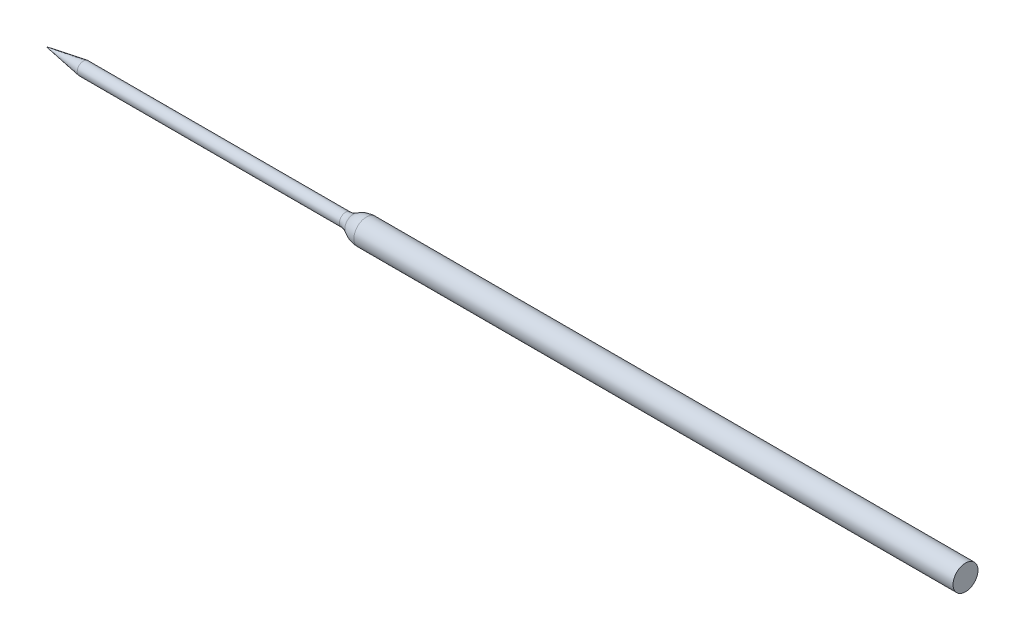
ISO-10303-21;
HEADER;
FILE_DESCRIPTION(('STEP AP214'),'2;1');
FILE_NAME('part.step','',(''),(''),'','','');
FILE_SCHEMA(('AUTOMOTIVE_DESIGN { 1 0 10303 214 1 1 1 1 }'));
ENDSEC;
DATA;
#1=APPLICATION_CONTEXT('core data for automotive mechanical design processes');
#2=APPLICATION_PROTOCOL_DEFINITION('international standard','automotive_design',2000,#1);
#3=PRODUCT_CONTEXT('',#1,'mechanical');
#4=PRODUCT('Part','Part','',(#3));
#5=PRODUCT_RELATED_PRODUCT_CATEGORY('part','',(#4));
#6=PRODUCT_DEFINITION_FORMATION('','',#4);
#7=PRODUCT_DEFINITION_CONTEXT('part definition',#1,'design');
#8=PRODUCT_DEFINITION('design','',#6,#7);
#9=PRODUCT_DEFINITION_SHAPE('','',#8);
#10=(LENGTH_UNIT() NAMED_UNIT(*) SI_UNIT(.MILLI.,.METRE.));
#11=(NAMED_UNIT(*) PLANE_ANGLE_UNIT() SI_UNIT($,.RADIAN.));
#12=(NAMED_UNIT(*) SI_UNIT($,.STERADIAN.) SOLID_ANGLE_UNIT());
#13=UNCERTAINTY_MEASURE_WITH_UNIT(LENGTH_MEASURE(1.E-05),#10,'distance_accuracy_value','');
#14=(GEOMETRIC_REPRESENTATION_CONTEXT(3) GLOBAL_UNCERTAINTY_ASSIGNED_CONTEXT((#13)) GLOBAL_UNIT_ASSIGNED_CONTEXT((#10,
#11,#12)) REPRESENTATION_CONTEXT('',''));
#15=CARTESIAN_POINT('',(0.,0.,0.));
#16=DIRECTION('',(0.,0.,1.));
#17=DIRECTION('',(1.,0.,0.));
#18=AXIS2_PLACEMENT_3D('',#15,#16,#17);
#19=CARTESIAN_POINT('',(4.7625,0.,0.));
#20=DIRECTION('',(1.,0.,0.));
#21=DIRECTION('',(0.,1.,0.));
#22=AXIS2_PLACEMENT_3D('',#19,#20,#21);
#23=CONICAL_SURFACE('',#22,0.79375,0.165148677414627);
#24=CARTESIAN_POINT('',(0.,0.,0.));
#25=VERTEX_POINT('',#24);
#26=VERTEX_LOOP('',#25);
#27=FACE_BOUND('',#26,.T.);
#28=CARTESIAN_POINT('',(4.7625,0.,0.));
#29=DIRECTION('',(-1.,0.,0.));
#30=DIRECTION('',(0.,-1.,0.));
#31=AXIS2_PLACEMENT_3D('',#28,#29,#30);
#32=CIRCLE('',#31,0.79375);
#33=CARTESIAN_POINT('',(4.7625,-0.79375,0.));
#34=VERTEX_POINT('',#33);
#35=EDGE_CURVE('E11',#34,#34,#32,.T.);
#36=ORIENTED_EDGE('',*,*,#35,.T.);
#37=EDGE_LOOP('',(#36));
#38=FACE_BOUND('',#37,.T.);
#39=ADVANCED_FACE('F31',(#27,#38),#23,.T.);
#40=CARTESIAN_POINT('',(0.,0.,0.));
#41=DIRECTION('',(-1.,0.,0.));
#42=DIRECTION('',(0.,-1.,0.));
#43=AXIS2_PLACEMENT_3D('',#40,#41,#42);
#44=CYLINDRICAL_SURFACE('',#43,0.79375);
#45=ORIENTED_EDGE('',*,*,#35,.F.);
#46=EDGE_LOOP('',(#45));
#47=FACE_BOUND('',#46,.T.);
#48=CARTESIAN_POINT('',(38.1,0.,0.));
#49=DIRECTION('',(-1.,0.,0.));
#50=DIRECTION('',(0.,-1.,0.));
#51=AXIS2_PLACEMENT_3D('',#48,#49,#50);
#52=CIRCLE('',#51,0.79375);
#53=CARTESIAN_POINT('',(38.1,-0.79375,0.));
#54=VERTEX_POINT('',#53);
#55=EDGE_CURVE('E37',#54,#54,#52,.T.);
#56=ORIENTED_EDGE('',*,*,#55,.T.);
#57=EDGE_LOOP('',(#56));
#58=FACE_BOUND('',#57,.T.);
#59=ADVANCED_FACE('F42',(#47,#58),#44,.T.);
#60=CARTESIAN_POINT('',(38.1,0.,0.));
#61=DIRECTION('',(-1.,0.,0.));
#62=DIRECTION('',(0.,-1.,0.));
#63=AXIS2_PLACEMENT_3D('',#60,#61,#62);
#64=TOROIDAL_SURFACE('',#63,2.59543573444682,1.80168573444682);
#65=ORIENTED_EDGE('',*,*,#55,.F.);
#66=EDGE_LOOP('',(#65));
#67=FACE_BOUND('',#66,.T.);
#68=CARTESIAN_POINT('',(39.0933633136187,0.,0.));
#69=DIRECTION('',(-1.,0.,0.));
#70=DIRECTION('',(0.,-1.,0.));
#71=AXIS2_PLACEMENT_3D('',#68,#69,#70);
#72=CIRCLE('',#71,1.09233866078004);
#73=CARTESIAN_POINT('',(39.0933633136187,-1.09233866078004,0.));
#74=VERTEX_POINT('',#73);
#75=EDGE_CURVE('E51',#74,#74,#72,.T.);
#76=ORIENTED_EDGE('',*,*,#75,.T.);
#77=EDGE_LOOP('',(#76));
#78=FACE_BOUND('',#77,.T.);
#79=ADVANCED_FACE('F47',(#67,#78),#64,.F.);
#80=CARTESIAN_POINT('',(40.7406968306331,0.,0.));
#81=DIRECTION('',(-1.,0.,0.));
#82=DIRECTION('',(0.,-1.,0.));
#83=AXIS2_PLACEMENT_3D('',#80,#81,#82);
#84=DEGENERATE_TOROIDAL_SURFACE('',#83,1.40030643173643,2.98780643173643,.F.);
#85=ORIENTED_EDGE('',*,*,#75,.F.);
#86=EDGE_LOOP('',(#85));
#87=FACE_BOUND('',#86,.T.);
#88=CARTESIAN_POINT('',(40.7406968306331,0.,0.));
#89=DIRECTION('',(-1.,0.,0.));
#90=DIRECTION('',(0.,-1.,0.));
#91=AXIS2_PLACEMENT_3D('',#88,#89,#90);
#92=CIRCLE('',#91,1.5875);
#93=CARTESIAN_POINT('',(40.7406968306331,-1.5875,0.));
#94=VERTEX_POINT('',#93);
#95=EDGE_CURVE('E53',#94,#94,#92,.T.);
#96=ORIENTED_EDGE('',*,*,#95,.T.);
#97=EDGE_LOOP('',(#96));
#98=FACE_BOUND('',#97,.T.);
#99=ADVANCED_FACE('F70',(#87,#98),#84,.F.);
#100=CARTESIAN_POINT('',(0.,0.,0.));
#101=DIRECTION('',(-1.,0.,0.));
#102=DIRECTION('',(0.,-1.,0.));
#103=AXIS2_PLACEMENT_3D('',#100,#101,#102);
#104=CYLINDRICAL_SURFACE('',#103,1.5875);
#105=ORIENTED_EDGE('',*,*,#95,.F.);
#106=EDGE_LOOP('',(#105));
#107=FACE_BOUND('',#106,.T.);
#108=CARTESIAN_POINT('',(116.940696830633,0.,0.));
#109=DIRECTION('',(-1.,0.,0.));
#110=DIRECTION('',(0.,-1.,0.));
#111=AXIS2_PLACEMENT_3D('',#108,#109,#110);
#112=CIRCLE('',#111,1.5875);
#113=CARTESIAN_POINT('',(116.940696830633,-1.5875,0.));
#114=VERTEX_POINT('',#113);
#115=EDGE_CURVE('E58',#114,#114,#112,.T.);
#116=ORIENTED_EDGE('',*,*,#115,.T.);
#117=EDGE_LOOP('',(#116));
#118=FACE_BOUND('',#117,.T.);
#119=ADVANCED_FACE('F62',(#107,#118),#104,.T.);
#120=CARTESIAN_POINT('',(116.940696830633,1.5875,0.));
#121=DIRECTION('',(-1.,0.,0.));
#122=DIRECTION('',(0.,-1.,0.));
#123=AXIS2_PLACEMENT_3D('',#120,#121,#122);
#124=PLANE('',#123);
#125=ORIENTED_EDGE('',*,*,#115,.F.);
#126=EDGE_LOOP('',(#125));
#127=FACE_BOUND('',#126,.T.);
#128=ADVANCED_FACE('F64',(#127),#124,.F.);
#129=CLOSED_SHELL('',(#39,#59,#79,#99,#119,#128));
#130=MANIFOLD_SOLID_BREP('B2',#129);
#131=ADVANCED_BREP_SHAPE_REPRESENTATION('',(#18,#130),#14);
#132=SHAPE_DEFINITION_REPRESENTATION(#9,#131);
ENDSEC;
END-ISO-10303-21;
